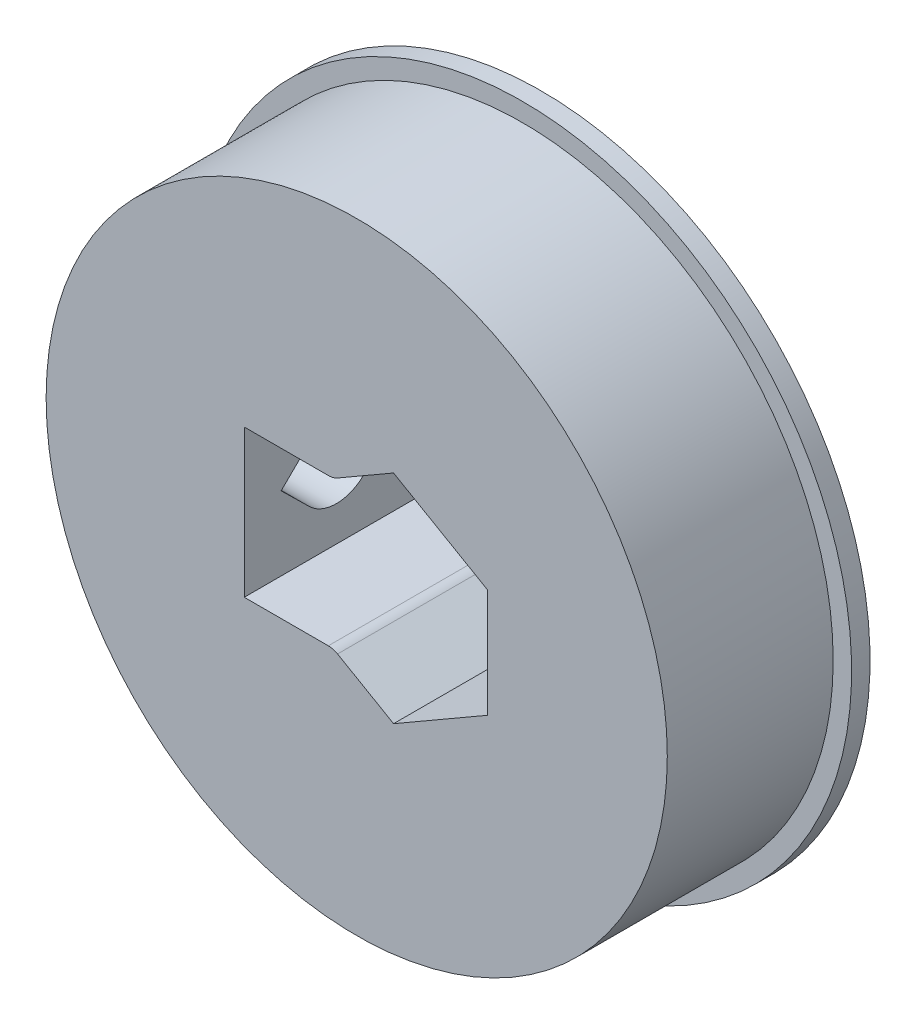
ISO-10303-21;
HEADER;
FILE_DESCRIPTION(('STEP AP214'),'2;1');
FILE_NAME('part.step','',(''),(''),'','','');
FILE_SCHEMA(('AUTOMOTIVE_DESIGN { 1 0 10303 214 1 1 1 1 }'));
ENDSEC;
DATA;
#1=APPLICATION_CONTEXT('core data for automotive mechanical design processes');
#2=APPLICATION_PROTOCOL_DEFINITION('international standard','automotive_design',2000,#1);
#3=PRODUCT_CONTEXT('',#1,'mechanical');
#4=PRODUCT('Part','Part','',(#3));
#5=PRODUCT_RELATED_PRODUCT_CATEGORY('part','',(#4));
#6=PRODUCT_DEFINITION_FORMATION('','',#4);
#7=PRODUCT_DEFINITION_CONTEXT('part definition',#1,'design');
#8=PRODUCT_DEFINITION('design','',#6,#7);
#9=PRODUCT_DEFINITION_SHAPE('','',#8);
#10=(LENGTH_UNIT() NAMED_UNIT(*) SI_UNIT(.MILLI.,.METRE.));
#11=(NAMED_UNIT(*) PLANE_ANGLE_UNIT() SI_UNIT($,.RADIAN.));
#12=(NAMED_UNIT(*) SI_UNIT($,.STERADIAN.) SOLID_ANGLE_UNIT());
#13=UNCERTAINTY_MEASURE_WITH_UNIT(LENGTH_MEASURE(1.E-05),#10,'distance_accuracy_value','');
#14=(GEOMETRIC_REPRESENTATION_CONTEXT(3) GLOBAL_UNCERTAINTY_ASSIGNED_CONTEXT((#13)) GLOBAL_UNIT_ASSIGNED_CONTEXT((#10,
#11,#12)) REPRESENTATION_CONTEXT('',''));
#15=CARTESIAN_POINT('',(0.,0.,0.));
#16=DIRECTION('',(0.,0.,1.));
#17=DIRECTION('',(1.,0.,0.));
#18=AXIS2_PLACEMENT_3D('',#15,#16,#17);
#19=CARTESIAN_POINT('',(-1.,0.,5.));
#20=DIRECTION('',(0.,0.,-1.));
#21=DIRECTION('',(-1.,0.,0.));
#22=AXIS2_PLACEMENT_3D('',#19,#20,#21);
#23=CYLINDRICAL_SURFACE('',#22,8.425);
#24=CARTESIAN_POINT('',(-1.,0.,5.));
#25=DIRECTION('',(0.,0.,1.));
#26=DIRECTION('',(1.,0.,0.));
#27=AXIS2_PLACEMENT_3D('',#24,#25,#26);
#28=CIRCLE('',#27,8.425);
#29=CARTESIAN_POINT('',(7.425,0.,5.));
#30=VERTEX_POINT('',#29);
#31=EDGE_CURVE('E271',#30,#30,#28,.T.);
#32=ORIENTED_EDGE('',*,*,#31,.F.);
#33=EDGE_LOOP('',(#32));
#34=FACE_BOUND('',#33,.T.);
#35=CARTESIAN_POINT('',(-1.,0.,1.));
#36=DIRECTION('',(0.,0.714142842854285,0.7));
#37=DIRECTION('',(0.,0.7,-0.714142842854285));
#38=AXIS2_PLACEMENT_3D('',#35,#36,#37);
#39=ELLIPSE('',#38,12.0357142857143,8.425);
#40=CARTESIAN_POINT('',(-9.425,0.,1.));
#41=VERTEX_POINT('',#40);
#42=CARTESIAN_POINT('',(-9.39156421652125,-0.749849984997001,1.765));
#43=VERTEX_POINT('',#42);
#44=EDGE_CURVE('E169',#41,#43,#39,.T.);
#45=ORIENTED_EDGE('',*,*,#44,.F.);
#46=CARTESIAN_POINT('',(-1.,0.,1.));
#47=DIRECTION('',(0.,0.714142842854285,-0.7));
#48=DIRECTION('',(0.,-0.7,-0.714142842854285));
#49=AXIS2_PLACEMENT_3D('',#46,#47,#48);
#50=ELLIPSE('',#49,12.0357142857143,8.425);
#51=CARTESIAN_POINT('',(-9.39156421652125,0.749849984996997,1.765));
#52=VERTEX_POINT('',#51);
#53=EDGE_CURVE('E158',#41,#52,#50,.T.);
#54=ORIENTED_EDGE('',*,*,#53,.T.);
#55=CARTESIAN_POINT('',(-9.39156421652125,0.749849984996997,1.765));
#56=CARTESIAN_POINT('',(-9.38971930147538,0.770496114662498,1.78606377672893));
#57=CARTESIAN_POINT('',(-9.38787782957001,0.790244978500352,1.80798764033091));
#58=CARTESIAN_POINT('',(-9.38425169536627,0.827831410246457,1.85342026342002));
#59=CARTESIAN_POINT('',(-9.38246703193006,0.845669016452907,1.8769289911339));
#60=CARTESIAN_POINT('',(-9.37727767812551,0.896095775290179,1.94956574031261));
#61=CARTESIAN_POINT('',(-9.3740323972141,0.925654984472622,2.00086167866803));
#62=CARTESIAN_POINT('',(-9.36834216816782,0.975763937982956,2.10773151824717));
#63=CARTESIAN_POINT('',(-9.36589773145843,0.996307927951239,2.16330812527242));
#64=CARTESIAN_POINT('',(-9.36209047046496,1.0277747569064,2.27714805454478));
#65=CARTESIAN_POINT('',(-9.36072730639297,1.03870061849087,2.33541052666913));
#66=CARTESIAN_POINT('',(-9.35924323462567,1.05057798880903,2.45265792643176));
#67=CARTESIAN_POINT('',(-9.35911606337212,1.05157978954129,2.51163769320643));
#68=CARTESIAN_POINT('',(-9.36010227847145,1.04370969824914,2.62893955296674));
#69=CARTESIAN_POINT('',(-9.36121594778637,1.03483555410873,2.68726149287701));
#70=CARTESIAN_POINT('',(-9.36455136632089,1.00751793304219,2.80140224690187));
#71=CARTESIAN_POINT('',(-9.36676995841902,0.989101714886996,2.85722770181553));
#72=CARTESIAN_POINT('',(-9.37206288577179,0.943247909201524,2.96497965397585));
#73=CARTESIAN_POINT('',(-9.3751366848834,0.915815971823759,3.01690856821295));
#74=CARTESIAN_POINT('',(-9.38051674713631,0.864837866455177,3.09654058893149));
#75=CARTESIAN_POINT('',(-9.38266637549587,0.84382426657973,3.12590763470267));
#76=CARTESIAN_POINT('',(-9.38706371983237,0.798933344094576,3.18227715127344));
#77=CARTESIAN_POINT('',(-9.38931126810558,0.775060804026532,3.20928344381657));
#78=CARTESIAN_POINT('',(-9.39156421652125,0.749849984996997,3.235));
#79=B_SPLINE_CURVE_WITH_KNOTS('',3,(#55,#56,#57,#58,#59,#60,#61,#62,#63,#64,#65,#66,#67,#68,#69,
#70,#71,#72,#73,#74,#75,#76,#77,#78),.UNSPECIFIED.,.F.,.F.,(4,2,2,2,2,2,2,2,2,2,2,4),(0.,
0.0886033285134298,0.177204881241708,0.354169815504846,0.531247541689939,0.708269599458344,
0.88439410374593,1.06055877979526,1.23622295971594,1.41177726012628,1.52012651639265,
1.62829698938134),.UNSPECIFIED.);
#80=CARTESIAN_POINT('',(-9.39156421652125,0.749849984996997,3.235));
#81=VERTEX_POINT('',#80);
#82=EDGE_CURVE('E168',#52,#81,#79,.T.);
#83=ORIENTED_EDGE('',*,*,#82,.T.);
#84=CARTESIAN_POINT('',(-1.,0.,4.));
#85=DIRECTION('',(0.,-0.714142842854285,-0.7));
#86=DIRECTION('',(0.,0.7,-0.714142842854285));
#87=AXIS2_PLACEMENT_3D('',#84,#85,#86);
#88=ELLIPSE('',#87,12.0357142857143,8.425);
#89=CARTESIAN_POINT('',(-9.425,0.,4.));
#90=VERTEX_POINT('',#89);
#91=EDGE_CURVE('E198',#90,#81,#88,.T.);
#92=ORIENTED_EDGE('',*,*,#91,.F.);
#93=CARTESIAN_POINT('',(-1.,0.,4.));
#94=DIRECTION('',(0.,-0.714142842854285,0.7));
#95=DIRECTION('',(0.,-0.7,-0.714142842854285));
#96=AXIS2_PLACEMENT_3D('',#93,#94,#95);
#97=ELLIPSE('',#96,12.0357142857143,8.425);
#98=CARTESIAN_POINT('',(-9.39156421652125,-0.749849984997002,3.235));
#99=VERTEX_POINT('',#98);
#100=EDGE_CURVE('E365',#90,#99,#97,.T.);
#101=ORIENTED_EDGE('',*,*,#100,.T.);
#102=CARTESIAN_POINT('',(-9.39156421652125,-0.749849984997001,3.235));
#103=CARTESIAN_POINT('',(-9.38971930147538,-0.770496114662502,3.21393622327107));
#104=CARTESIAN_POINT('',(-9.38787782957001,-0.790244978500357,3.19201235966909));
#105=CARTESIAN_POINT('',(-9.38425169536627,-0.827831410246461,3.14657973657998));
#106=CARTESIAN_POINT('',(-9.38246703193006,-0.845669016452911,3.1230710088661));
#107=CARTESIAN_POINT('',(-9.37727767812551,-0.896095775290183,3.05043425968739));
#108=CARTESIAN_POINT('',(-9.3740323972141,-0.925654984472626,2.99913832133197));
#109=CARTESIAN_POINT('',(-9.36834216816782,-0.97576393798296,2.89226848175283));
#110=CARTESIAN_POINT('',(-9.36589773145843,-0.996307927951243,2.83669187472758));
#111=CARTESIAN_POINT('',(-9.36209047046496,-1.0277747569064,2.72285194545521));
#112=CARTESIAN_POINT('',(-9.36072730639297,-1.03870061849087,2.66458947333087));
#113=CARTESIAN_POINT('',(-9.35924323462567,-1.05057798880903,2.54734207356824));
#114=CARTESIAN_POINT('',(-9.35911606337212,-1.0515797895413,2.48836230679357));
#115=CARTESIAN_POINT('',(-9.36010227847145,-1.04370969824914,2.37106044703325));
#116=CARTESIAN_POINT('',(-9.36121594778637,-1.03483555410874,2.31273850712299));
#117=CARTESIAN_POINT('',(-9.36455136632089,-1.00751793304219,2.19859775309813));
#118=CARTESIAN_POINT('',(-9.36676995841902,-0.989101714886999,2.14277229818447));
#119=CARTESIAN_POINT('',(-9.37206288577178,-0.943247909201527,2.03502034602414));
#120=CARTESIAN_POINT('',(-9.3751366848834,-0.915815971823762,1.98309143178705));
#121=CARTESIAN_POINT('',(-9.38051674713631,-0.86483786645518,1.9034594110685));
#122=CARTESIAN_POINT('',(-9.38266637549587,-0.843824266579733,1.87409236529733));
#123=CARTESIAN_POINT('',(-9.38706371983237,-0.79893334409458,1.81772284872656));
#124=CARTESIAN_POINT('',(-9.38931126810558,-0.775060804026535,1.79071655618343));
#125=CARTESIAN_POINT('',(-9.39156421652126,-0.749849984997001,1.765));
#126=B_SPLINE_CURVE_WITH_KNOTS('',3,(#102,#103,#104,#105,#106,#107,#108,#109,#110,#111,#112,
#113,#114,#115,#116,#117,#118,#119,#120,#121,#122,#123,#124,#125),.UNSPECIFIED.,.F.,.F.,(4,2,2,
2,2,2,2,2,2,2,2,4),(0.,0.0886033285134298,0.177204881241708,0.354169815504845,0.531247541689939,
0.708269599458343,0.88439410374593,1.06055877979526,1.23622295971594,1.41177726012628,
1.52012651639265,1.62829698938134),.UNSPECIFIED.);
#127=EDGE_CURVE('E180',#99,#43,#126,.T.);
#128=ORIENTED_EDGE('',*,*,#127,.T.);
#129=EDGE_LOOP('',(#45,#54,#83,#92,#101,#128));
#130=FACE_BOUND('',#129,.T.);
#131=CARTESIAN_POINT('',(-1.,0.,0.5));
#132=DIRECTION('',(0.,0.,-1.));
#133=DIRECTION('',(-1.,0.,0.));
#134=AXIS2_PLACEMENT_3D('',#131,#132,#133);
#135=CIRCLE('',#134,8.425);
#136=CARTESIAN_POINT('',(-9.425,0.,0.5));
#137=VERTEX_POINT('',#136);
#138=EDGE_CURVE('E11',#137,#137,#135,.T.);
#139=ORIENTED_EDGE('',*,*,#138,.F.);
#140=EDGE_LOOP('',(#139));
#141=FACE_BOUND('',#140,.T.);
#142=ADVANCED_FACE('F43',(#34,#130,#141),#23,.T.);
#143=CARTESIAN_POINT('',(-1.,0.,5.));
#144=DIRECTION('',(0.,0.,1.));
#145=DIRECTION('',(1.,0.,0.));
#146=AXIS2_PLACEMENT_3D('',#143,#144,#145);
#147=PLANE('',#146);
#148=ORIENTED_EDGE('',*,*,#31,.T.);
#149=EDGE_LOOP('',(#148));
#150=FACE_BOUND('',#149,.T.);
#151=DIRECTION('',(0.866025403784439,-0.5,0.));
#152=VECTOR('',#151,1.);
#153=CARTESIAN_POINT('',(-2.55,-1.47224318643355,5.));
#154=LINE('',#153,#152);
#155=CARTESIAN_POINT('',(-1.51987298107781,-2.06698729810778,5.));
#156=VERTEX_POINT('',#155);
#157=CARTESIAN_POINT('',(0.,-2.94448637286709,5.));
#158=VERTEX_POINT('',#157);
#159=EDGE_CURVE('E322',#156,#158,#154,.T.);
#160=ORIENTED_EDGE('',*,*,#159,.F.);
#161=CARTESIAN_POINT('',(-1.76987298107781,-2.5,5.));
#162=DIRECTION('',(0.,0.,1.));
#163=DIRECTION('',(1.,0.,0.));
#164=AXIS2_PLACEMENT_3D('',#161,#162,#163);
#165=CIRCLE('',#164,0.5);
#166=CARTESIAN_POINT('',(-1.76987298107781,-2.,5.));
#167=VERTEX_POINT('',#166);
#168=EDGE_CURVE('E284',#156,#167,#165,.T.);
#169=ORIENTED_EDGE('',*,*,#168,.T.);
#170=DIRECTION('',(-1.,0.,0.));
#171=VECTOR('',#170,1.);
#172=CARTESIAN_POINT('',(-1.05,-2.,5.));
#173=LINE('',#172,#171);
#174=CARTESIAN_POINT('',(-4.05,-2.,5.));
#175=VERTEX_POINT('',#174);
#176=EDGE_CURVE('E345',#167,#175,#173,.T.);
#177=ORIENTED_EDGE('',*,*,#176,.T.);
#178=DIRECTION('',(0.,-1.,0.));
#179=VECTOR('',#178,1.);
#180=CARTESIAN_POINT('',(-4.05,-2.,5.));
#181=LINE('',#180,#179);
#182=CARTESIAN_POINT('',(-4.05,2.,5.));
#183=VERTEX_POINT('',#182);
#184=EDGE_CURVE('E309',#183,#175,#181,.T.);
#185=ORIENTED_EDGE('',*,*,#184,.F.);
#186=DIRECTION('',(-1.,0.,0.));
#187=VECTOR('',#186,1.);
#188=CARTESIAN_POINT('',(-1.05,2.,5.));
#189=LINE('',#188,#187);
#190=CARTESIAN_POINT('',(-1.76987298107781,2.,5.));
#191=VERTEX_POINT('',#190);
#192=EDGE_CURVE('E298',#191,#183,#189,.T.);
#193=ORIENTED_EDGE('',*,*,#192,.F.);
#194=CARTESIAN_POINT('',(-1.76987298107781,2.5,5.));
#195=DIRECTION('',(0.,0.,1.));
#196=DIRECTION('',(1.,0.,0.));
#197=AXIS2_PLACEMENT_3D('',#194,#195,#196);
#198=CIRCLE('',#197,0.5);
#199=CARTESIAN_POINT('',(-1.51987298107781,2.06698729810778,5.));
#200=VERTEX_POINT('',#199);
#201=EDGE_CURVE('E276',#191,#200,#198,.T.);
#202=ORIENTED_EDGE('',*,*,#201,.T.);
#203=DIRECTION('',(-0.866025403784439,-0.5,0.));
#204=VECTOR('',#203,1.);
#205=CARTESIAN_POINT('',(0.,2.94448637286709,5.));
#206=LINE('',#205,#204);
#207=CARTESIAN_POINT('',(0.,2.94448637286709,5.));
#208=VERTEX_POINT('',#207);
#209=EDGE_CURVE('E318',#208,#200,#206,.T.);
#210=ORIENTED_EDGE('',*,*,#209,.F.);
#211=DIRECTION('',(-0.866025403784439,0.5,0.));
#212=VECTOR('',#211,1.);
#213=CARTESIAN_POINT('',(2.55,1.47224318643355,5.));
#214=LINE('',#213,#212);
#215=CARTESIAN_POINT('',(2.55,1.47224318643355,5.));
#216=VERTEX_POINT('',#215);
#217=EDGE_CURVE('E349',#216,#208,#214,.T.);
#218=ORIENTED_EDGE('',*,*,#217,.F.);
#219=DIRECTION('',(0.,1.,0.));
#220=VECTOR('',#219,1.);
#221=CARTESIAN_POINT('',(2.55,-1.47224318643355,5.));
#222=LINE('',#221,#220);
#223=CARTESIAN_POINT('',(2.55,-1.47224318643355,5.));
#224=VERTEX_POINT('',#223);
#225=EDGE_CURVE('E351',#224,#216,#222,.T.);
#226=ORIENTED_EDGE('',*,*,#225,.F.);
#227=DIRECTION('',(0.866025403784439,0.5,0.));
#228=VECTOR('',#227,1.);
#229=CARTESIAN_POINT('',(0.,-2.94448637286709,5.));
#230=LINE('',#229,#228);
#231=EDGE_CURVE('E324',#158,#224,#230,.T.);
#232=ORIENTED_EDGE('',*,*,#231,.F.);
#233=EDGE_LOOP('',(#160,#169,#177,#185,#193,#202,#210,#218,#226,#232));
#234=FACE_BOUND('',#233,.T.);
#235=ADVANCED_FACE('F255',(#150,#234),#147,.T.);
#236=CARTESIAN_POINT('',(-1.,0.,0.));
#237=DIRECTION('',(0.,0.,1.));
#238=DIRECTION('',(1.,0.,0.));
#239=AXIS2_PLACEMENT_3D('',#236,#237,#238);
#240=PLANE('',#239);
#241=DIRECTION('',(-1.,0.,0.));
#242=VECTOR('',#241,1.);
#243=CARTESIAN_POINT('',(-1.05,-2.,0.));
#244=LINE('',#243,#242);
#245=CARTESIAN_POINT('',(-1.76987298107781,-2.,0.));
#246=VERTEX_POINT('',#245);
#247=CARTESIAN_POINT('',(-4.05,-2.,0.));
#248=VERTEX_POINT('',#247);
#249=EDGE_CURVE('E355',#246,#248,#244,.T.);
#250=ORIENTED_EDGE('',*,*,#249,.F.);
#251=CARTESIAN_POINT('',(-1.76987298107781,-2.5,0.));
#252=DIRECTION('',(0.,0.,1.));
#253=DIRECTION('',(1.,0.,0.));
#254=AXIS2_PLACEMENT_3D('',#251,#252,#253);
#255=CIRCLE('',#254,0.5);
#256=CARTESIAN_POINT('',(-1.51987298107781,-2.06698729810778,0.));
#257=VERTEX_POINT('',#256);
#258=EDGE_CURVE('E290',#246,#257,#255,.F.);
#259=ORIENTED_EDGE('',*,*,#258,.T.);
#260=DIRECTION('',(0.866025403784439,-0.5,0.));
#261=VECTOR('',#260,1.);
#262=CARTESIAN_POINT('',(-2.55,-1.47224318643355,0.));
#263=LINE('',#262,#261);
#264=CARTESIAN_POINT('',(0.,-2.94448637286709,0.));
#265=VERTEX_POINT('',#264);
#266=EDGE_CURVE('E343',#257,#265,#263,.T.);
#267=ORIENTED_EDGE('',*,*,#266,.T.);
#268=DIRECTION('',(0.866025403784439,0.5,0.));
#269=VECTOR('',#268,1.);
#270=CARTESIAN_POINT('',(0.,-2.94448637286709,0.));
#271=LINE('',#270,#269);
#272=CARTESIAN_POINT('',(2.55,-1.47224318643355,0.));
#273=VERTEX_POINT('',#272);
#274=EDGE_CURVE('E338',#265,#273,#271,.T.);
#275=ORIENTED_EDGE('',*,*,#274,.T.);
#276=DIRECTION('',(0.,1.,0.));
#277=VECTOR('',#276,1.);
#278=CARTESIAN_POINT('',(2.55,-1.47224318643355,0.));
#279=LINE('',#278,#277);
#280=CARTESIAN_POINT('',(2.55,1.47224318643355,0.));
#281=VERTEX_POINT('',#280);
#282=EDGE_CURVE('E326',#273,#281,#279,.T.);
#283=ORIENTED_EDGE('',*,*,#282,.T.);
#284=DIRECTION('',(-0.866025403784439,0.5,0.));
#285=VECTOR('',#284,1.);
#286=CARTESIAN_POINT('',(2.55,1.47224318643355,0.));
#287=LINE('',#286,#285);
#288=CARTESIAN_POINT('',(0.,2.94448637286709,0.));
#289=VERTEX_POINT('',#288);
#290=EDGE_CURVE('E321',#281,#289,#287,.T.);
#291=ORIENTED_EDGE('',*,*,#290,.T.);
#292=DIRECTION('',(-0.866025403784439,-0.5,0.));
#293=VECTOR('',#292,1.);
#294=CARTESIAN_POINT('',(0.,2.94448637286709,0.));
#295=LINE('',#294,#293);
#296=CARTESIAN_POINT('',(-1.51987298107781,2.06698729810778,0.));
#297=VERTEX_POINT('',#296);
#298=EDGE_CURVE('E316',#289,#297,#295,.T.);
#299=ORIENTED_EDGE('',*,*,#298,.T.);
#300=CARTESIAN_POINT('',(-1.76987298107781,2.5,0.));
#301=DIRECTION('',(0.,0.,1.));
#302=DIRECTION('',(1.,0.,0.));
#303=AXIS2_PLACEMENT_3D('',#300,#301,#302);
#304=CIRCLE('',#303,0.5);
#305=CARTESIAN_POINT('',(-1.76987298107781,2.,0.));
#306=VERTEX_POINT('',#305);
#307=EDGE_CURVE('E288',#297,#306,#304,.F.);
#308=ORIENTED_EDGE('',*,*,#307,.T.);
#309=DIRECTION('',(-1.,0.,0.));
#310=VECTOR('',#309,1.);
#311=CARTESIAN_POINT('',(-1.05,2.,0.));
#312=LINE('',#311,#310);
#313=CARTESIAN_POINT('',(-4.05,2.,0.));
#314=VERTEX_POINT('',#313);
#315=EDGE_CURVE('E300',#306,#314,#312,.T.);
#316=ORIENTED_EDGE('',*,*,#315,.T.);
#317=DIRECTION('',(0.,1.,0.));
#318=VECTOR('',#317,1.);
#319=CARTESIAN_POINT('',(-4.05,-2.,0.));
#320=LINE('',#319,#318);
#321=EDGE_CURVE('E359',#248,#314,#320,.T.);
#322=ORIENTED_EDGE('',*,*,#321,.F.);
#323=EDGE_LOOP('',(#250,#259,#267,#275,#283,#291,#299,#308,#316,#322));
#324=FACE_BOUND('',#323,.T.);
#325=CARTESIAN_POINT('',(-1.,0.,0.));
#326=DIRECTION('',(0.,0.,-1.));
#327=DIRECTION('',(-1.,0.,0.));
#328=AXIS2_PLACEMENT_3D('',#325,#326,#327);
#329=CIRCLE('',#328,8.925);
#330=CARTESIAN_POINT('',(-9.925,0.,0.));
#331=VERTEX_POINT('',#330);
#332=EDGE_CURVE('E393',#331,#331,#329,.T.);
#333=ORIENTED_EDGE('',*,*,#332,.T.);
#334=EDGE_LOOP('',(#333));
#335=FACE_BOUND('',#334,.T.);
#336=ADVANCED_FACE('F253',(#324,#335),#240,.F.);
#337=CARTESIAN_POINT('',(-2.55,-1.47224318643355,5.));
#338=DIRECTION('',(0.5,0.866025403784439,0.));
#339=DIRECTION('',(-0.866025403784439,0.5,0.));
#340=AXIS2_PLACEMENT_3D('',#337,#338,#339);
#341=PLANE('',#340);
#342=ORIENTED_EDGE('',*,*,#266,.F.);
#343=DIRECTION('',(0.,0.,1.));
#344=VECTOR('',#343,1.);
#345=CARTESIAN_POINT('',(-1.51987298107781,-2.06698729810778,5.));
#346=LINE('',#345,#344);
#347=EDGE_CURVE('E272',#257,#156,#346,.T.);
#348=ORIENTED_EDGE('',*,*,#347,.T.);
#349=ORIENTED_EDGE('',*,*,#159,.T.);
#350=DIRECTION('',(0.,0.,-1.));
#351=VECTOR('',#350,1.);
#352=CARTESIAN_POINT('',(0.,-2.94448637286709,5.));
#353=LINE('',#352,#351);
#354=EDGE_CURVE('E273',#158,#265,#353,.T.);
#355=ORIENTED_EDGE('',*,*,#354,.T.);
#356=EDGE_LOOP('',(#342,#348,#349,#355));
#357=FACE_BOUND('',#356,.T.);
#358=ADVANCED_FACE('F239',(#357),#341,.T.);
#359=CARTESIAN_POINT('',(0.,2.94448637286709,5.));
#360=DIRECTION('',(0.5,-0.866025403784439,0.));
#361=DIRECTION('',(0.866025403784439,0.5,0.));
#362=AXIS2_PLACEMENT_3D('',#359,#360,#361);
#363=PLANE('',#362);
#364=ORIENTED_EDGE('',*,*,#209,.T.);
#365=DIRECTION('',(0.,0.,-1.));
#366=VECTOR('',#365,1.);
#367=CARTESIAN_POINT('',(-1.51987298107781,2.06698729810778,5.));
#368=LINE('',#367,#366);
#369=EDGE_CURVE('E292',#200,#297,#368,.T.);
#370=ORIENTED_EDGE('',*,*,#369,.T.);
#371=ORIENTED_EDGE('',*,*,#298,.F.);
#372=DIRECTION('',(0.,0.,-1.));
#373=VECTOR('',#372,1.);
#374=CARTESIAN_POINT('',(0.,2.94448637286709,5.));
#375=LINE('',#374,#373);
#376=EDGE_CURVE('E330',#208,#289,#375,.T.);
#377=ORIENTED_EDGE('',*,*,#376,.F.);
#378=EDGE_LOOP('',(#364,#370,#371,#377));
#379=FACE_BOUND('',#378,.T.);
#380=ADVANCED_FACE('F235',(#379),#363,.T.);
#381=CARTESIAN_POINT('',(0.,-2.94448637286709,5.));
#382=DIRECTION('',(-0.5,0.866025403784439,0.));
#383=DIRECTION('',(-0.866025403784439,-0.5,0.));
#384=AXIS2_PLACEMENT_3D('',#381,#382,#383);
#385=PLANE('',#384);
#386=ORIENTED_EDGE('',*,*,#274,.F.);
#387=ORIENTED_EDGE('',*,*,#354,.F.);
#388=ORIENTED_EDGE('',*,*,#231,.T.);
#389=DIRECTION('',(0.,0.,-1.));
#390=VECTOR('',#389,1.);
#391=CARTESIAN_POINT('',(2.55,-1.47224318643355,5.));
#392=LINE('',#391,#390);
#393=EDGE_CURVE('E279',#224,#273,#392,.T.);
#394=ORIENTED_EDGE('',*,*,#393,.T.);
#395=EDGE_LOOP('',(#386,#387,#388,#394));
#396=FACE_BOUND('',#395,.T.);
#397=ADVANCED_FACE('F238',(#396),#385,.T.);
#398=CARTESIAN_POINT('',(2.55,-1.47224318643355,5.));
#399=DIRECTION('',(-1.,0.,0.));
#400=DIRECTION('',(0.,0.,1.));
#401=AXIS2_PLACEMENT_3D('',#398,#399,#400);
#402=PLANE('',#401);
#403=ORIENTED_EDGE('',*,*,#282,.F.);
#404=ORIENTED_EDGE('',*,*,#393,.F.);
#405=ORIENTED_EDGE('',*,*,#225,.T.);
#406=DIRECTION('',(0.,0.,-1.));
#407=VECTOR('',#406,1.);
#408=CARTESIAN_POINT('',(2.55,1.47224318643355,5.));
#409=LINE('',#408,#407);
#410=EDGE_CURVE('E332',#216,#281,#409,.T.);
#411=ORIENTED_EDGE('',*,*,#410,.T.);
#412=EDGE_LOOP('',(#403,#404,#405,#411));
#413=FACE_BOUND('',#412,.T.);
#414=ADVANCED_FACE('F243',(#413),#402,.T.);
#415=CARTESIAN_POINT('',(2.55,1.47224318643355,5.));
#416=DIRECTION('',(-0.5,-0.866025403784439,0.));
#417=DIRECTION('',(0.866025403784439,-0.5,0.));
#418=AXIS2_PLACEMENT_3D('',#415,#416,#417);
#419=PLANE('',#418);
#420=ORIENTED_EDGE('',*,*,#290,.F.);
#421=ORIENTED_EDGE('',*,*,#410,.F.);
#422=ORIENTED_EDGE('',*,*,#217,.T.);
#423=ORIENTED_EDGE('',*,*,#376,.T.);
#424=EDGE_LOOP('',(#420,#421,#422,#423));
#425=FACE_BOUND('',#424,.T.);
#426=ADVANCED_FACE('F233',(#425),#419,.T.);
#427=CARTESIAN_POINT('',(-1.05,-2.,0.));
#428=DIRECTION('',(0.,1.,0.));
#429=DIRECTION('',(-1.,0.,0.));
#430=AXIS2_PLACEMENT_3D('',#427,#428,#429);
#431=PLANE('',#430);
#432=ORIENTED_EDGE('',*,*,#176,.F.);
#433=DIRECTION('',(0.,0.,1.));
#434=VECTOR('',#433,1.);
#435=CARTESIAN_POINT('',(-1.76987298107781,-2.,0.));
#436=LINE('',#435,#434);
#437=EDGE_CURVE('E286',#167,#246,#436,.F.);
#438=ORIENTED_EDGE('',*,*,#437,.T.);
#439=ORIENTED_EDGE('',*,*,#249,.T.);
#440=DIRECTION('',(0.,0.,-1.));
#441=VECTOR('',#440,1.);
#442=CARTESIAN_POINT('',(-4.05,-2.,0.));
#443=LINE('',#442,#441);
#444=EDGE_CURVE('E362',#175,#248,#443,.T.);
#445=ORIENTED_EDGE('',*,*,#444,.F.);
#446=EDGE_LOOP('',(#432,#438,#439,#445));
#447=FACE_BOUND('',#446,.T.);
#448=ADVANCED_FACE('F229',(#447),#431,.T.);
#449=CARTESIAN_POINT('',(-1.05,2.,0.));
#450=DIRECTION('',(0.,-1.,0.));
#451=DIRECTION('',(1.,0.,0.));
#452=AXIS2_PLACEMENT_3D('',#449,#450,#451);
#453=PLANE('',#452);
#454=ORIENTED_EDGE('',*,*,#315,.F.);
#455=DIRECTION('',(0.,0.,-1.));
#456=VECTOR('',#455,1.);
#457=CARTESIAN_POINT('',(-1.76987298107781,2.,0.));
#458=LINE('',#457,#456);
#459=EDGE_CURVE('E52',#306,#191,#458,.F.);
#460=ORIENTED_EDGE('',*,*,#459,.T.);
#461=ORIENTED_EDGE('',*,*,#192,.T.);
#462=DIRECTION('',(0.,0.,1.));
#463=VECTOR('',#462,1.);
#464=CARTESIAN_POINT('',(-4.05,2.,0.));
#465=LINE('',#464,#463);
#466=EDGE_CURVE('E310',#314,#183,#465,.T.);
#467=ORIENTED_EDGE('',*,*,#466,.F.);
#468=EDGE_LOOP('',(#454,#460,#461,#467));
#469=FACE_BOUND('',#468,.T.);
#470=ADVANCED_FACE('F225',(#469),#453,.T.);
#471=CARTESIAN_POINT('',(-4.05,0.,0.));
#472=DIRECTION('',(1.,0.,0.));
#473=DIRECTION('',(0.,1.,0.));
#474=AXIS2_PLACEMENT_3D('',#471,#472,#473);
#475=PLANE('',#474);
#476=DIRECTION('',(0.,-0.7,-0.714142842854285));
#477=VECTOR('',#476,1.);
#478=CARTESIAN_POINT('',(-4.05,-1.999599959992,1.96));
#479=LINE('',#478,#477);
#480=CARTESIAN_POINT('',(-4.05,0.,4.));
#481=VERTEX_POINT('',#480);
#482=CARTESIAN_POINT('',(-4.05,-0.749849984997,3.235));
#483=VERTEX_POINT('',#482);
#484=EDGE_CURVE('E67',#481,#483,#479,.T.);
#485=ORIENTED_EDGE('',*,*,#484,.F.);
#486=DIRECTION('',(0.,0.7,-0.714142842854285));
#487=VECTOR('',#486,1.);
#488=CARTESIAN_POINT('',(-4.05,1.999599959992,1.96));
#489=LINE('',#488,#487);
#490=CARTESIAN_POINT('',(-4.05,0.749849984996999,3.235));
#491=VERTEX_POINT('',#490);
#492=EDGE_CURVE('E382',#481,#491,#489,.T.);
#493=ORIENTED_EDGE('',*,*,#492,.T.);
#494=CARTESIAN_POINT('',(-4.05,0.,2.5));
#495=DIRECTION('',(1.,0.,0.));
#496=DIRECTION('',(0.,1.,0.));
#497=AXIS2_PLACEMENT_3D('',#494,#495,#496);
#498=CIRCLE('',#497,1.05);
#499=CARTESIAN_POINT('',(-4.05,0.749849984996999,1.765));
#500=VERTEX_POINT('',#499);
#501=EDGE_CURVE('E374',#500,#491,#498,.T.);
#502=ORIENTED_EDGE('',*,*,#501,.F.);
#503=DIRECTION('',(0.,0.7,0.714142842854285));
#504=VECTOR('',#503,1.);
#505=CARTESIAN_POINT('',(-4.05,-0.499899989998,0.490000000000001));
#506=LINE('',#505,#504);
#507=CARTESIAN_POINT('',(-4.05,0.,1.));
#508=VERTEX_POINT('',#507);
#509=EDGE_CURVE('E384',#508,#500,#506,.T.);
#510=ORIENTED_EDGE('',*,*,#509,.F.);
#511=DIRECTION('',(0.,-0.7,0.714142842854285));
#512=VECTOR('',#511,1.);
#513=CARTESIAN_POINT('',(-4.05,0.499899989997999,0.49));
#514=LINE('',#513,#512);
#515=CARTESIAN_POINT('',(-4.05,-0.749849984997,1.765));
#516=VERTEX_POINT('',#515);
#517=EDGE_CURVE('E175',#508,#516,#514,.T.);
#518=ORIENTED_EDGE('',*,*,#517,.T.);
#519=CARTESIAN_POINT('',(-4.05,0.,2.5));
#520=DIRECTION('',(1.,0.,0.));
#521=DIRECTION('',(0.,1.,0.));
#522=AXIS2_PLACEMENT_3D('',#519,#520,#521);
#523=CIRCLE('',#522,1.05);
#524=EDGE_CURVE('E389',#483,#516,#523,.T.);
#525=ORIENTED_EDGE('',*,*,#524,.F.);
#526=EDGE_LOOP('',(#485,#493,#502,#510,#518,#525));
#527=FACE_BOUND('',#526,.T.);
#528=ORIENTED_EDGE('',*,*,#184,.T.);
#529=ORIENTED_EDGE('',*,*,#444,.T.);
#530=ORIENTED_EDGE('',*,*,#321,.T.);
#531=ORIENTED_EDGE('',*,*,#466,.T.);
#532=EDGE_LOOP('',(#528,#529,#530,#531));
#533=FACE_BOUND('',#532,.T.);
#534=ADVANCED_FACE('F221',(#527,#533),#475,.T.);
#535=CARTESIAN_POINT('',(-1.76987298107781,-2.5,5.));
#536=DIRECTION('',(0.,0.,1.));
#537=DIRECTION('',(1.,0.,0.));
#538=AXIS2_PLACEMENT_3D('',#535,#536,#537);
#539=CYLINDRICAL_SURFACE('',#538,0.5);
#540=ORIENTED_EDGE('',*,*,#258,.F.);
#541=ORIENTED_EDGE('',*,*,#437,.F.);
#542=ORIENTED_EDGE('',*,*,#168,.F.);
#543=ORIENTED_EDGE('',*,*,#347,.F.);
#544=EDGE_LOOP('',(#540,#541,#542,#543));
#545=FACE_BOUND('',#544,.T.);
#546=ADVANCED_FACE('F224',(#545),#539,.T.);
#547=CARTESIAN_POINT('',(-1.76987298107781,2.5,5.));
#548=DIRECTION('',(0.,0.,-1.));
#549=DIRECTION('',(-1.,0.,0.));
#550=AXIS2_PLACEMENT_3D('',#547,#548,#549);
#551=CYLINDRICAL_SURFACE('',#550,0.5);
#552=ORIENTED_EDGE('',*,*,#201,.F.);
#553=ORIENTED_EDGE('',*,*,#459,.F.);
#554=ORIENTED_EDGE('',*,*,#307,.F.);
#555=ORIENTED_EDGE('',*,*,#369,.F.);
#556=EDGE_LOOP('',(#552,#553,#554,#555));
#557=FACE_BOUND('',#556,.T.);
#558=ADVANCED_FACE('F45',(#557),#551,.T.);
#559=CARTESIAN_POINT('',(-9.425,-1.999599959992,1.96));
#560=DIRECTION('',(0.,-0.714142842854285,0.7));
#561=DIRECTION('',(0.,-0.7,-0.714142842854285));
#562=AXIS2_PLACEMENT_3D('',#559,#560,#561);
#563=PLANE('',#562);
#564=DIRECTION('',(1.,0.,0.));
#565=VECTOR('',#564,1.);
#566=CARTESIAN_POINT('',(-9.425,0.,4.));
#567=LINE('',#566,#565);
#568=EDGE_CURVE('E182',#90,#481,#567,.T.);
#569=ORIENTED_EDGE('',*,*,#568,.T.);
#570=ORIENTED_EDGE('',*,*,#484,.T.);
#571=DIRECTION('',(1.,0.,0.));
#572=VECTOR('',#571,1.);
#573=CARTESIAN_POINT('',(-9.425,-0.749849984997002,3.235));
#574=LINE('',#573,#572);
#575=EDGE_CURVE('E381',#99,#483,#574,.T.);
#576=ORIENTED_EDGE('',*,*,#575,.F.);
#577=ORIENTED_EDGE('',*,*,#100,.F.);
#578=EDGE_LOOP('',(#569,#570,#576,#577));
#579=FACE_BOUND('',#578,.T.);
#580=ADVANCED_FACE('F218',(#579),#563,.F.);
#581=CARTESIAN_POINT('',(-9.425,1.999599959992,1.96));
#582=DIRECTION('',(0.,-0.714142842854285,-0.7));
#583=DIRECTION('',(0.,0.7,-0.714142842854285));
#584=AXIS2_PLACEMENT_3D('',#581,#582,#583);
#585=PLANE('',#584);
#586=ORIENTED_EDGE('',*,*,#91,.T.);
#587=DIRECTION('',(1.,0.,0.));
#588=VECTOR('',#587,1.);
#589=CARTESIAN_POINT('',(-9.425,0.749849984996997,3.235));
#590=LINE('',#589,#588);
#591=EDGE_CURVE('E371',#81,#491,#590,.T.);
#592=ORIENTED_EDGE('',*,*,#591,.T.);
#593=ORIENTED_EDGE('',*,*,#492,.F.);
#594=ORIENTED_EDGE('',*,*,#568,.F.);
#595=EDGE_LOOP('',(#586,#592,#593,#594));
#596=FACE_BOUND('',#595,.T.);
#597=ADVANCED_FACE('F207',(#596),#585,.T.);
#598=CARTESIAN_POINT('',(-9.425,0.,2.5));
#599=DIRECTION('',(1.,0.,0.));
#600=DIRECTION('',(0.,1.,0.));
#601=AXIS2_PLACEMENT_3D('',#598,#599,#600);
#602=CYLINDRICAL_SURFACE('',#601,1.05);
#603=DIRECTION('',(1.,0.,0.));
#604=VECTOR('',#603,1.);
#605=CARTESIAN_POINT('',(-9.425,0.749849984996997,1.765));
#606=LINE('',#605,#604);
#607=EDGE_CURVE('E164',#52,#500,#606,.T.);
#608=ORIENTED_EDGE('',*,*,#607,.T.);
#609=ORIENTED_EDGE('',*,*,#501,.T.);
#610=ORIENTED_EDGE('',*,*,#591,.F.);
#611=ORIENTED_EDGE('',*,*,#82,.F.);
#612=EDGE_LOOP('',(#608,#609,#610,#611));
#613=FACE_BOUND('',#612,.T.);
#614=ADVANCED_FACE('F202',(#613),#602,.F.);
#615=CARTESIAN_POINT('',(-9.425,-0.499899989998002,0.490000000000001));
#616=DIRECTION('',(0.,0.714142842854285,-0.7));
#617=DIRECTION('',(0.,0.7,0.714142842854285));
#618=AXIS2_PLACEMENT_3D('',#615,#616,#617);
#619=PLANE('',#618);
#620=DIRECTION('',(1.,0.,0.));
#621=VECTOR('',#620,1.);
#622=CARTESIAN_POINT('',(-9.425,0.,1.));
#623=LINE('',#622,#621);
#624=EDGE_CURVE('E162',#41,#508,#623,.T.);
#625=ORIENTED_EDGE('',*,*,#624,.T.);
#626=ORIENTED_EDGE('',*,*,#509,.T.);
#627=ORIENTED_EDGE('',*,*,#607,.F.);
#628=ORIENTED_EDGE('',*,*,#53,.F.);
#629=EDGE_LOOP('',(#625,#626,#627,#628));
#630=FACE_BOUND('',#629,.T.);
#631=ADVANCED_FACE('F160',(#630),#619,.F.);
#632=CARTESIAN_POINT('',(-9.425,0.499899989997997,0.49));
#633=DIRECTION('',(0.,0.714142842854285,0.7));
#634=DIRECTION('',(0.,-0.7,0.714142842854285));
#635=AXIS2_PLACEMENT_3D('',#632,#633,#634);
#636=PLANE('',#635);
#637=ORIENTED_EDGE('',*,*,#44,.T.);
#638=DIRECTION('',(1.,0.,0.));
#639=VECTOR('',#638,1.);
#640=CARTESIAN_POINT('',(-9.425,-0.749849984997001,1.765));
#641=LINE('',#640,#639);
#642=EDGE_CURVE('E59',#43,#516,#641,.T.);
#643=ORIENTED_EDGE('',*,*,#642,.T.);
#644=ORIENTED_EDGE('',*,*,#517,.F.);
#645=ORIENTED_EDGE('',*,*,#624,.F.);
#646=EDGE_LOOP('',(#637,#643,#644,#645));
#647=FACE_BOUND('',#646,.T.);
#648=ADVANCED_FACE('F172',(#647),#636,.T.);
#649=CARTESIAN_POINT('',(-9.425,0.,2.5));
#650=DIRECTION('',(1.,0.,0.));
#651=DIRECTION('',(0.,1.,0.));
#652=AXIS2_PLACEMENT_3D('',#649,#650,#651);
#653=CYLINDRICAL_SURFACE('',#652,1.05);
#654=ORIENTED_EDGE('',*,*,#575,.T.);
#655=ORIENTED_EDGE('',*,*,#524,.T.);
#656=ORIENTED_EDGE('',*,*,#642,.F.);
#657=ORIENTED_EDGE('',*,*,#127,.F.);
#658=EDGE_LOOP('',(#654,#655,#656,#657));
#659=FACE_BOUND('',#658,.T.);
#660=ADVANCED_FACE('F213',(#659),#653,.F.);
#661=CARTESIAN_POINT('',(-1.,0.,0.5));
#662=DIRECTION('',(0.,0.,-1.));
#663=DIRECTION('',(-1.,0.,0.));
#664=AXIS2_PLACEMENT_3D('',#661,#662,#663);
#665=CYLINDRICAL_SURFACE('',#664,8.925);
#666=CARTESIAN_POINT('',(-1.,0.,0.5));
#667=DIRECTION('',(0.,0.,-1.));
#668=DIRECTION('',(-1.,0.,0.));
#669=AXIS2_PLACEMENT_3D('',#666,#667,#668);
#670=CIRCLE('',#669,8.925);
#671=CARTESIAN_POINT('',(-9.925,0.,0.5));
#672=VERTEX_POINT('',#671);
#673=EDGE_CURVE('E392',#672,#672,#670,.T.);
#674=ORIENTED_EDGE('',*,*,#673,.T.);
#675=EDGE_LOOP('',(#674));
#676=FACE_BOUND('',#675,.T.);
#677=ORIENTED_EDGE('',*,*,#332,.F.);
#678=EDGE_LOOP('',(#677));
#679=FACE_BOUND('',#678,.T.);
#680=ADVANCED_FACE('F217',(#676,#679),#665,.T.);
#681=CARTESIAN_POINT('',(-1.,0.,0.5));
#682=DIRECTION('',(0.,0.,-1.));
#683=DIRECTION('',(-1.,0.,0.));
#684=AXIS2_PLACEMENT_3D('',#681,#682,#683);
#685=PLANE('',#684);
#686=ORIENTED_EDGE('',*,*,#138,.T.);
#687=EDGE_LOOP('',(#686));
#688=FACE_BOUND('',#687,.T.);
#689=ORIENTED_EDGE('',*,*,#673,.F.);
#690=EDGE_LOOP('',(#689));
#691=FACE_BOUND('',#690,.T.);
#692=ADVANCED_FACE('F403',(#688,#691),#685,.F.);
#693=CLOSED_SHELL('',(#142,#235,#336,#358,#380,#397,#414,#426,#448,#470,#534,#546,#558,#580,
#597,#614,#631,#648,#660,#680,#692));
#694=MANIFOLD_SOLID_BREP('B2',#693);
#695=ADVANCED_BREP_SHAPE_REPRESENTATION('',(#18,#694),#14);
#696=SHAPE_DEFINITION_REPRESENTATION(#9,#695);
ENDSEC;
END-ISO-10303-21;
